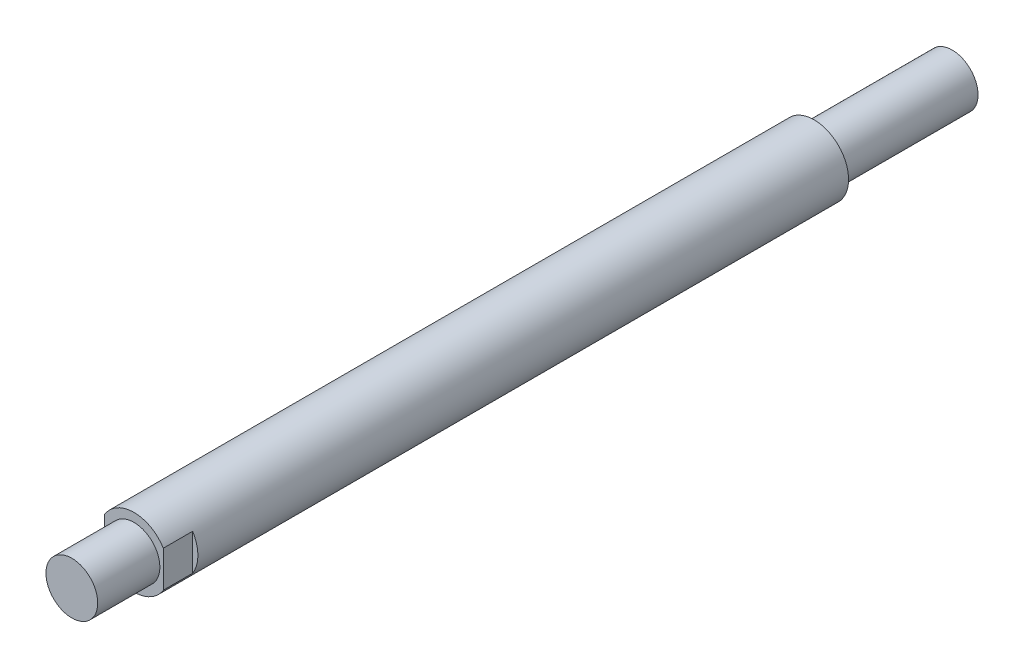
ISO-10303-21;
HEADER;
FILE_DESCRIPTION(('STEP AP214'),'2;1');
FILE_NAME('part.step','',(''),(''),'','','');
FILE_SCHEMA(('AUTOMOTIVE_DESIGN { 1 0 10303 214 1 1 1 1 }'));
ENDSEC;
DATA;
#1=APPLICATION_CONTEXT('core data for automotive mechanical design processes');
#2=APPLICATION_PROTOCOL_DEFINITION('international standard','automotive_design',2000,#1);
#3=PRODUCT_CONTEXT('',#1,'mechanical');
#4=PRODUCT('Part','Part','',(#3));
#5=PRODUCT_RELATED_PRODUCT_CATEGORY('part','',(#4));
#6=PRODUCT_DEFINITION_FORMATION('','',#4);
#7=PRODUCT_DEFINITION_CONTEXT('part definition',#1,'design');
#8=PRODUCT_DEFINITION('design','',#6,#7);
#9=PRODUCT_DEFINITION_SHAPE('','',#8);
#10=(LENGTH_UNIT() NAMED_UNIT(*) SI_UNIT(.MILLI.,.METRE.));
#11=(NAMED_UNIT(*) PLANE_ANGLE_UNIT() SI_UNIT($,.RADIAN.));
#12=(NAMED_UNIT(*) SI_UNIT($,.STERADIAN.) SOLID_ANGLE_UNIT());
#13=UNCERTAINTY_MEASURE_WITH_UNIT(LENGTH_MEASURE(1.E-05),#10,'distance_accuracy_value','');
#14=(GEOMETRIC_REPRESENTATION_CONTEXT(3) GLOBAL_UNCERTAINTY_ASSIGNED_CONTEXT((#13)) GLOBAL_UNIT_ASSIGNED_CONTEXT((#10,
#11,#12)) REPRESENTATION_CONTEXT('',''));
#15=CARTESIAN_POINT('',(0.,0.,0.));
#16=DIRECTION('',(0.,0.,1.));
#17=DIRECTION('',(1.,0.,0.));
#18=AXIS2_PLACEMENT_3D('',#15,#16,#17);
#19=CARTESIAN_POINT('',(4.44089209850063E-13,-8.88178419700125E-13,255.));
#20=DIRECTION('',(0.,0.,-1.));
#21=DIRECTION('',(-0.999999999999999,0.,0.));
#22=AXIS2_PLACEMENT_3D('',#19,#20,#21);
#23=CYLINDRICAL_SURFACE('',#22,20.);
#24=CARTESIAN_POINT('',(1.11022302462516E-12,-6.66133814775094E-13,219.));
#25=DIRECTION('',(0.,0.,1.));
#26=DIRECTION('',(0.999999999999999,0.,0.));
#27=AXIS2_PLACEMENT_3D('',#24,#25,#26);
#28=CIRCLE('',#27,20.);
#29=CARTESIAN_POINT('',(-16.999999999999,-10.5356537528534,219.));
#30=VERTEX_POINT('',#29);
#31=CARTESIAN_POINT('',(17.0000000000003,-10.5356537528534,218.999999999999));
#32=VERTEX_POINT('',#31);
#33=EDGE_CURVE('E108',#30,#32,#28,.T.);
#34=ORIENTED_EDGE('',*,*,#33,.F.);
#35=DIRECTION('',(0.,0.,-1.));
#36=VECTOR('',#35,1.);
#37=CARTESIAN_POINT('',(-16.999999999999,-10.5356537528534,255.));
#38=LINE('',#37,#36);
#39=CARTESIAN_POINT('',(-16.9999999999992,-10.5356537528531,202.));
#40=VERTEX_POINT('',#39);
#41=EDGE_CURVE('E67',#30,#40,#38,.T.);
#42=ORIENTED_EDGE('',*,*,#41,.T.);
#43=CARTESIAN_POINT('',(0.,4.44089209850063E-13,201.999999999999));
#44=DIRECTION('',(0.,0.,1.));
#45=DIRECTION('',(0.999999999999999,0.,0.));
#46=AXIS2_PLACEMENT_3D('',#43,#44,#45);
#47=CIRCLE('',#46,20.);
#48=CARTESIAN_POINT('',(-16.9999999999999,10.5356537528534,202.));
#49=VERTEX_POINT('',#48);
#50=EDGE_CURVE('E13',#49,#40,#47,.T.);
#51=ORIENTED_EDGE('',*,*,#50,.F.);
#52=DIRECTION('',(0.,0.,-1.));
#53=VECTOR('',#52,1.);
#54=CARTESIAN_POINT('',(-16.9999999999995,10.5356537528534,255.));
#55=LINE('',#54,#53);
#56=CARTESIAN_POINT('',(-16.9999999999988,10.535653752852,219.));
#57=VERTEX_POINT('',#56);
#58=EDGE_CURVE('E136',#49,#57,#55,.F.);
#59=ORIENTED_EDGE('',*,*,#58,.T.);
#60=CARTESIAN_POINT('',(17.0000000000008,10.5356537528534,219.));
#61=VERTEX_POINT('',#60);
#62=EDGE_CURVE('E102',#61,#57,#28,.T.);
#63=ORIENTED_EDGE('',*,*,#62,.F.);
#64=DIRECTION('',(0.,0.,-1.));
#65=VECTOR('',#64,1.);
#66=CARTESIAN_POINT('',(17.0000000000001,10.5356537528534,255.));
#67=LINE('',#66,#65);
#68=CARTESIAN_POINT('',(17.0000000000008,10.535653752852,201.999999999999));
#69=VERTEX_POINT('',#68);
#70=EDGE_CURVE('E75',#61,#69,#67,.T.);
#71=ORIENTED_EDGE('',*,*,#70,.T.);
#72=CARTESIAN_POINT('',(0.,4.44089209850063E-13,201.999999999999));
#73=DIRECTION('',(0.,0.,1.));
#74=DIRECTION('',(0.999999999999999,0.,0.));
#75=AXIS2_PLACEMENT_3D('',#72,#73,#74);
#76=CIRCLE('',#75,20.);
#77=CARTESIAN_POINT('',(17.0000000000003,-10.5356537528529,202.));
#78=VERTEX_POINT('',#77);
#79=EDGE_CURVE('E60',#78,#69,#76,.T.);
#80=ORIENTED_EDGE('',*,*,#79,.F.);
#81=DIRECTION('',(0.,0.,-1.));
#82=VECTOR('',#81,1.);
#83=CARTESIAN_POINT('',(17.0000000000008,-10.5356537528543,255.));
#84=LINE('',#83,#82);
#85=EDGE_CURVE('E94',#78,#32,#84,.F.);
#86=ORIENTED_EDGE('',*,*,#85,.T.);
#87=EDGE_LOOP('',(#34,#42,#51,#59,#63,#71,#80,#86));
#88=FACE_BOUND('',#87,.T.);
#89=CARTESIAN_POINT('',(8.88178419700125E-13,-6.66133814775094E-13,-175.));
#90=DIRECTION('',(0.,0.,-1.));
#91=DIRECTION('',(-0.999999999999999,0.,0.));
#92=AXIS2_PLACEMENT_3D('',#89,#90,#91);
#93=CIRCLE('',#92,20.);
#94=CARTESIAN_POINT('',(-19.9999999999991,-6.67244037799719E-13,-175.));
#95=VERTEX_POINT('',#94);
#96=EDGE_CURVE('E132',#95,#95,#93,.T.);
#97=ORIENTED_EDGE('',*,*,#96,.F.);
#98=EDGE_LOOP('',(#97));
#99=FACE_BOUND('',#98,.T.);
#100=ADVANCED_FACE('F52',(#88,#99),#23,.T.);
#101=CARTESIAN_POINT('',(1.11022302462516E-12,-6.66133814775094E-13,219.));
#102=DIRECTION('',(0.,0.,1.));
#103=DIRECTION('',(0.999999999999999,0.,0.));
#104=AXIS2_PLACEMENT_3D('',#101,#102,#103);
#105=PLANE('',#104);
#106=DIRECTION('',(0.,1.,0.));
#107=VECTOR('',#106,1.);
#108=CARTESIAN_POINT('',(-16.9999999999995,-2.22044604925031E-13,219.));
#109=LINE('',#108,#107);
#110=EDGE_CURVE('E101',#30,#57,#109,.T.);
#111=ORIENTED_EDGE('',*,*,#110,.F.);
#112=ORIENTED_EDGE('',*,*,#33,.T.);
#113=DIRECTION('',(0.,-1.,0.));
#114=VECTOR('',#113,1.);
#115=CARTESIAN_POINT('',(17.0000000000001,-2.22044604925031E-13,219.));
#116=LINE('',#115,#114);
#117=EDGE_CURVE('E91',#61,#32,#116,.T.);
#118=ORIENTED_EDGE('',*,*,#117,.F.);
#119=ORIENTED_EDGE('',*,*,#62,.T.);
#120=EDGE_LOOP('',(#111,#112,#118,#119));
#121=FACE_BOUND('',#120,.T.);
#122=CARTESIAN_POINT('',(1.11022302462516E-12,-6.66133814775094E-13,219.));
#123=DIRECTION('',(0.,0.,1.));
#124=DIRECTION('',(0.999999999999999,0.,0.));
#125=AXIS2_PLACEMENT_3D('',#122,#123,#124);
#126=CIRCLE('',#125,15.);
#127=CARTESIAN_POINT('',(15.0000000000011,-6.65301147506625E-13,219.));
#128=VERTEX_POINT('',#127);
#129=EDGE_CURVE('E115',#128,#128,#126,.T.);
#130=ORIENTED_EDGE('',*,*,#129,.F.);
#131=EDGE_LOOP('',(#130));
#132=FACE_BOUND('',#131,.T.);
#133=ADVANCED_FACE('F112',(#121,#132),#105,.T.);
#134=CARTESIAN_POINT('',(1.11022302462516E-12,-6.66133814775094E-13,219.));
#135=DIRECTION('',(0.,0.,1.));
#136=DIRECTION('',(0.999999999999999,0.,0.));
#137=AXIS2_PLACEMENT_3D('',#134,#135,#136);
#138=CYLINDRICAL_SURFACE('',#137,15.);
#139=ORIENTED_EDGE('',*,*,#129,.T.);
#140=EDGE_LOOP('',(#139));
#141=FACE_BOUND('',#140,.T.);
#142=CARTESIAN_POINT('',(4.44089209850063E-13,-8.88178419700125E-13,255.));
#143=DIRECTION('',(0.,0.,1.));
#144=DIRECTION('',(0.999999999999999,0.,0.));
#145=AXIS2_PLACEMENT_3D('',#142,#143,#144);
#146=CIRCLE('',#145,15.);
#147=CARTESIAN_POINT('',(15.0000000000004,-8.87345752431656E-13,255.));
#148=VERTEX_POINT('',#147);
#149=EDGE_CURVE('E121',#148,#148,#146,.T.);
#150=ORIENTED_EDGE('',*,*,#149,.F.);
#151=EDGE_LOOP('',(#150));
#152=FACE_BOUND('',#151,.T.);
#153=ADVANCED_FACE('F152',(#141,#152),#138,.T.);
#154=CARTESIAN_POINT('',(4.44089209850063E-13,-8.88178419700125E-13,255.));
#155=DIRECTION('',(0.,0.,1.));
#156=DIRECTION('',(0.999999999999999,0.,0.));
#157=AXIS2_PLACEMENT_3D('',#154,#155,#156);
#158=PLANE('',#157);
#159=ORIENTED_EDGE('',*,*,#149,.T.);
#160=EDGE_LOOP('',(#159));
#161=FACE_BOUND('',#160,.T.);
#162=ADVANCED_FACE('F150',(#161),#158,.T.);
#163=CARTESIAN_POINT('',(0.,4.44089209850063E-13,201.999999999999));
#164=DIRECTION('',(0.,0.,1.));
#165=DIRECTION('',(0.999999999999999,0.,0.));
#166=AXIS2_PLACEMENT_3D('',#163,#164,#165);
#167=PLANE('',#166);
#168=ORIENTED_EDGE('',*,*,#79,.T.);
#169=DIRECTION('',(0.,-1.,0.));
#170=VECTOR('',#169,1.);
#171=CARTESIAN_POINT('',(17.0000000000003,23.4494563811189,202.));
#172=LINE('',#171,#170);
#173=EDGE_CURVE('E130',#69,#78,#172,.T.);
#174=ORIENTED_EDGE('',*,*,#173,.T.);
#175=EDGE_LOOP('',(#168,#174));
#176=FACE_BOUND('',#175,.T.);
#177=ADVANCED_FACE('F129',(#176),#167,.T.);
#178=CARTESIAN_POINT('',(17.0000000000003,23.4494563811189,202.));
#179=DIRECTION('',(-1.,0.,0.));
#180=DIRECTION('',(0.,-1.,0.));
#181=AXIS2_PLACEMENT_3D('',#178,#179,#180);
#182=PLANE('',#181);
#183=ORIENTED_EDGE('',*,*,#117,.T.);
#184=ORIENTED_EDGE('',*,*,#85,.F.);
#185=ORIENTED_EDGE('',*,*,#173,.F.);
#186=ORIENTED_EDGE('',*,*,#70,.F.);
#187=EDGE_LOOP('',(#183,#184,#185,#186));
#188=FACE_BOUND('',#187,.T.);
#189=ADVANCED_FACE('F93',(#188),#182,.F.);
#190=CARTESIAN_POINT('',(0.,4.44089209850063E-13,201.999999999999));
#191=DIRECTION('',(0.,0.,1.));
#192=DIRECTION('',(0.999999999999999,0.,0.));
#193=AXIS2_PLACEMENT_3D('',#190,#191,#192);
#194=PLANE('',#193);
#195=ORIENTED_EDGE('',*,*,#50,.T.);
#196=DIRECTION('',(0.,1.,0.));
#197=VECTOR('',#196,1.);
#198=CARTESIAN_POINT('',(-16.999999999999,28.290634472705,202.));
#199=LINE('',#198,#197);
#200=EDGE_CURVE('E110',#40,#49,#199,.T.);
#201=ORIENTED_EDGE('',*,*,#200,.T.);
#202=EDGE_LOOP('',(#195,#201));
#203=FACE_BOUND('',#202,.T.);
#204=ADVANCED_FACE('F200',(#203),#194,.T.);
#205=CARTESIAN_POINT('',(-16.999999999999,28.290634472705,202.));
#206=DIRECTION('',(0.999999999999999,0.,0.));
#207=DIRECTION('',(0.,1.,0.));
#208=AXIS2_PLACEMENT_3D('',#205,#206,#207);
#209=PLANE('',#208);
#210=ORIENTED_EDGE('',*,*,#110,.T.);
#211=ORIENTED_EDGE('',*,*,#58,.F.);
#212=ORIENTED_EDGE('',*,*,#200,.F.);
#213=ORIENTED_EDGE('',*,*,#41,.F.);
#214=EDGE_LOOP('',(#210,#211,#212,#213));
#215=FACE_BOUND('',#214,.T.);
#216=ADVANCED_FACE('F208',(#215),#209,.F.);
#217=CARTESIAN_POINT('',(8.88178419700125E-13,-6.66133814775094E-13,-175.));
#218=DIRECTION('',(0.,0.,-1.));
#219=DIRECTION('',(-0.999999999999999,0.,0.));
#220=AXIS2_PLACEMENT_3D('',#217,#218,#219);
#221=PLANE('',#220);
#222=CARTESIAN_POINT('',(8.88178419700125E-13,-6.66133814775094E-13,-175.));
#223=DIRECTION('',(0.,0.,-1.));
#224=DIRECTION('',(-0.999999999999999,0.,0.));
#225=AXIS2_PLACEMENT_3D('',#222,#223,#224);
#226=CIRCLE('',#225,15.);
#227=CARTESIAN_POINT('',(-14.9999999999991,-6.66966482043563E-13,-175.));
#228=VERTEX_POINT('',#227);
#229=EDGE_CURVE('E266',#228,#228,#226,.T.);
#230=ORIENTED_EDGE('',*,*,#229,.F.);
#231=EDGE_LOOP('',(#230));
#232=FACE_BOUND('',#231,.T.);
#233=ORIENTED_EDGE('',*,*,#96,.T.);
#234=EDGE_LOOP('',(#233));
#235=FACE_BOUND('',#234,.T.);
#236=ADVANCED_FACE('F218',(#232,#235),#221,.T.);
#237=CARTESIAN_POINT('',(8.88178419700125E-13,-6.66133814775094E-13,-175.));
#238=DIRECTION('',(0.,0.,-1.));
#239=DIRECTION('',(-0.999999999999999,0.,0.));
#240=AXIS2_PLACEMENT_3D('',#237,#238,#239);
#241=CYLINDRICAL_SURFACE('',#240,15.);
#242=ORIENTED_EDGE('',*,*,#229,.T.);
#243=EDGE_LOOP('',(#242));
#244=FACE_BOUND('',#243,.T.);
#245=CARTESIAN_POINT('',(8.88178419700125E-13,-8.88178419700125E-13,-255.));
#246=DIRECTION('',(0.,0.,-1.));
#247=DIRECTION('',(-0.999999999999999,0.,0.));
#248=AXIS2_PLACEMENT_3D('',#245,#246,#247);
#249=CIRCLE('',#248,15.);
#250=CARTESIAN_POINT('',(-14.9999999999991,-8.89011086968594E-13,-255.));
#251=VERTEX_POINT('',#250);
#252=EDGE_CURVE('E263',#251,#251,#249,.T.);
#253=ORIENTED_EDGE('',*,*,#252,.F.);
#254=EDGE_LOOP('',(#253));
#255=FACE_BOUND('',#254,.T.);
#256=ADVANCED_FACE('F228',(#244,#255),#241,.T.);
#257=CARTESIAN_POINT('',(8.88178419700125E-13,-8.88178419700125E-13,-255.));
#258=DIRECTION('',(0.,0.,1.));
#259=DIRECTION('',(0.999999999999999,0.,0.));
#260=AXIS2_PLACEMENT_3D('',#257,#258,#259);
#261=PLANE('',#260);
#262=ORIENTED_EDGE('',*,*,#252,.T.);
#263=EDGE_LOOP('',(#262));
#264=FACE_BOUND('',#263,.T.);
#265=ADVANCED_FACE('F238',(#264),#261,.F.);
#266=CLOSED_SHELL('',(#100,#133,#153,#162,#177,#189,#204,#216,#236,#256,#265));
#267=MANIFOLD_SOLID_BREP('B2',#266);
#268=ADVANCED_BREP_SHAPE_REPRESENTATION('',(#18,#267),#14);
#269=SHAPE_DEFINITION_REPRESENTATION(#9,#268);
ENDSEC;
END-ISO-10303-21;
